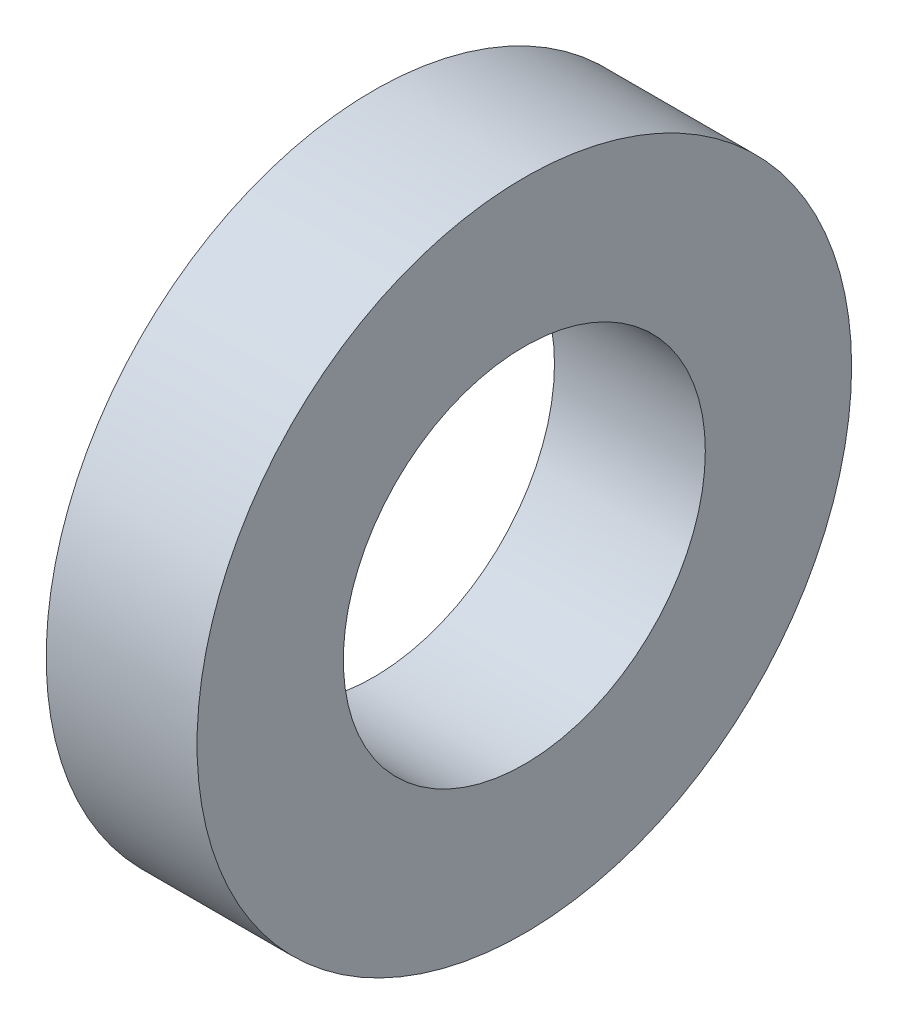
ISO-10303-21;
HEADER;
FILE_DESCRIPTION(('STEP AP214'),'2;1');
FILE_NAME('part.step','',(''),(''),'','','');
FILE_SCHEMA(('AUTOMOTIVE_DESIGN { 1 0 10303 214 1 1 1 1 }'));
ENDSEC;
DATA;
#1=APPLICATION_CONTEXT('core data for automotive mechanical design processes');
#2=APPLICATION_PROTOCOL_DEFINITION('international standard','automotive_design',2000,#1);
#3=PRODUCT_CONTEXT('',#1,'mechanical');
#4=PRODUCT('Part','Part','',(#3));
#5=PRODUCT_RELATED_PRODUCT_CATEGORY('part','',(#4));
#6=PRODUCT_DEFINITION_FORMATION('','',#4);
#7=PRODUCT_DEFINITION_CONTEXT('part definition',#1,'design');
#8=PRODUCT_DEFINITION('design','',#6,#7);
#9=PRODUCT_DEFINITION_SHAPE('','',#8);
#10=(LENGTH_UNIT() NAMED_UNIT(*) SI_UNIT(.MILLI.,.METRE.));
#11=(NAMED_UNIT(*) PLANE_ANGLE_UNIT() SI_UNIT($,.RADIAN.));
#12=(NAMED_UNIT(*) SI_UNIT($,.STERADIAN.) SOLID_ANGLE_UNIT());
#13=UNCERTAINTY_MEASURE_WITH_UNIT(LENGTH_MEASURE(1.E-05),#10,'distance_accuracy_value','');
#14=(GEOMETRIC_REPRESENTATION_CONTEXT(3) GLOBAL_UNCERTAINTY_ASSIGNED_CONTEXT((#13)) GLOBAL_UNIT_ASSIGNED_CONTEXT((#10,
#11,#12)) REPRESENTATION_CONTEXT('',''));
#15=CARTESIAN_POINT('',(0.,0.,0.));
#16=DIRECTION('',(0.,0.,1.));
#17=DIRECTION('',(1.,0.,0.));
#18=AXIS2_PLACEMENT_3D('',#15,#16,#17);
#19=CARTESIAN_POINT('',(5.,0.,0.));
#20=DIRECTION('',(1.,0.,0.));
#21=DIRECTION('',(0.,0.,-1.));
#22=AXIS2_PLACEMENT_3D('',#19,#20,#21);
#23=PLANE('',#22);
#24=CARTESIAN_POINT('',(5.,0.,0.));
#25=DIRECTION('',(1.,0.,0.));
#26=DIRECTION('',(0.,0.,-1.));
#27=AXIS2_PLACEMENT_3D('',#24,#25,#26);
#28=CIRCLE('',#27,10.8494937360837);
#29=CARTESIAN_POINT('',(5.,0.,-10.8494937360837));
#30=VERTEX_POINT('',#29);
#31=EDGE_CURVE('E10',#30,#30,#28,.T.);
#32=ORIENTED_EDGE('',*,*,#31,.T.);
#33=EDGE_LOOP('',(#32));
#34=FACE_BOUND('',#33,.T.);
#35=CARTESIAN_POINT('',(5.,0.,0.));
#36=DIRECTION('',(1.,0.,0.));
#37=DIRECTION('',(0.,0.,-1.));
#38=AXIS2_PLACEMENT_3D('',#35,#36,#37);
#39=CIRCLE('',#38,6.);
#40=CARTESIAN_POINT('',(5.,0.,-6.));
#41=VERTEX_POINT('',#40);
#42=EDGE_CURVE('E47',#41,#41,#39,.T.);
#43=ORIENTED_EDGE('',*,*,#42,.F.);
#44=EDGE_LOOP('',(#43));
#45=FACE_BOUND('',#44,.T.);
#46=ADVANCED_FACE('F36',(#34,#45),#23,.T.);
#47=CARTESIAN_POINT('',(0.,0.,0.));
#48=DIRECTION('',(1.,0.,0.));
#49=DIRECTION('',(0.,0.,-1.));
#50=AXIS2_PLACEMENT_3D('',#47,#48,#49);
#51=PLANE('',#50);
#52=CARTESIAN_POINT('',(0.,0.,0.));
#53=DIRECTION('',(1.,0.,0.));
#54=DIRECTION('',(0.,0.,-1.));
#55=AXIS2_PLACEMENT_3D('',#52,#53,#54);
#56=CIRCLE('',#55,10.8494937360837);
#57=CARTESIAN_POINT('',(0.,0.,-10.8494937360837));
#58=VERTEX_POINT('',#57);
#59=EDGE_CURVE('E40',#58,#58,#56,.T.);
#60=ORIENTED_EDGE('',*,*,#59,.F.);
#61=EDGE_LOOP('',(#60));
#62=FACE_BOUND('',#61,.T.);
#63=CARTESIAN_POINT('',(0.,0.,0.));
#64=DIRECTION('',(1.,0.,0.));
#65=DIRECTION('',(0.,0.,-1.));
#66=AXIS2_PLACEMENT_3D('',#63,#64,#65);
#67=CIRCLE('',#66,6.);
#68=CARTESIAN_POINT('',(0.,0.,-6.));
#69=VERTEX_POINT('',#68);
#70=EDGE_CURVE('E49',#69,#69,#67,.T.);
#71=ORIENTED_EDGE('',*,*,#70,.T.);
#72=EDGE_LOOP('',(#71));
#73=FACE_BOUND('',#72,.T.);
#74=ADVANCED_FACE('F59',(#62,#73),#51,.F.);
#75=CARTESIAN_POINT('',(5.,0.,0.));
#76=DIRECTION('',(-1.,0.,0.));
#77=DIRECTION('',(0.,0.,1.));
#78=AXIS2_PLACEMENT_3D('',#75,#76,#77);
#79=CYLINDRICAL_SURFACE('',#78,10.8494937360837);
#80=ORIENTED_EDGE('',*,*,#31,.F.);
#81=EDGE_LOOP('',(#80));
#82=FACE_BOUND('',#81,.T.);
#83=ORIENTED_EDGE('',*,*,#59,.T.);
#84=EDGE_LOOP('',(#83));
#85=FACE_BOUND('',#84,.T.);
#86=ADVANCED_FACE('F38',(#82,#85),#79,.T.);
#87=CARTESIAN_POINT('',(5.,0.,0.));
#88=DIRECTION('',(-1.,0.,0.));
#89=DIRECTION('',(0.,0.,1.));
#90=AXIS2_PLACEMENT_3D('',#87,#88,#89);
#91=CYLINDRICAL_SURFACE('',#90,6.);
#92=ORIENTED_EDGE('',*,*,#42,.T.);
#93=EDGE_LOOP('',(#92));
#94=FACE_BOUND('',#93,.T.);
#95=ORIENTED_EDGE('',*,*,#70,.F.);
#96=EDGE_LOOP('',(#95));
#97=FACE_BOUND('',#96,.T.);
#98=ADVANCED_FACE('F55',(#94,#97),#91,.F.);
#99=CLOSED_SHELL('',(#46,#74,#86,#98));
#100=MANIFOLD_SOLID_BREP('B2',#99);
#101=ADVANCED_BREP_SHAPE_REPRESENTATION('',(#18,#100),#14);
#102=SHAPE_DEFINITION_REPRESENTATION(#9,#101);
ENDSEC;
END-ISO-10303-21;
